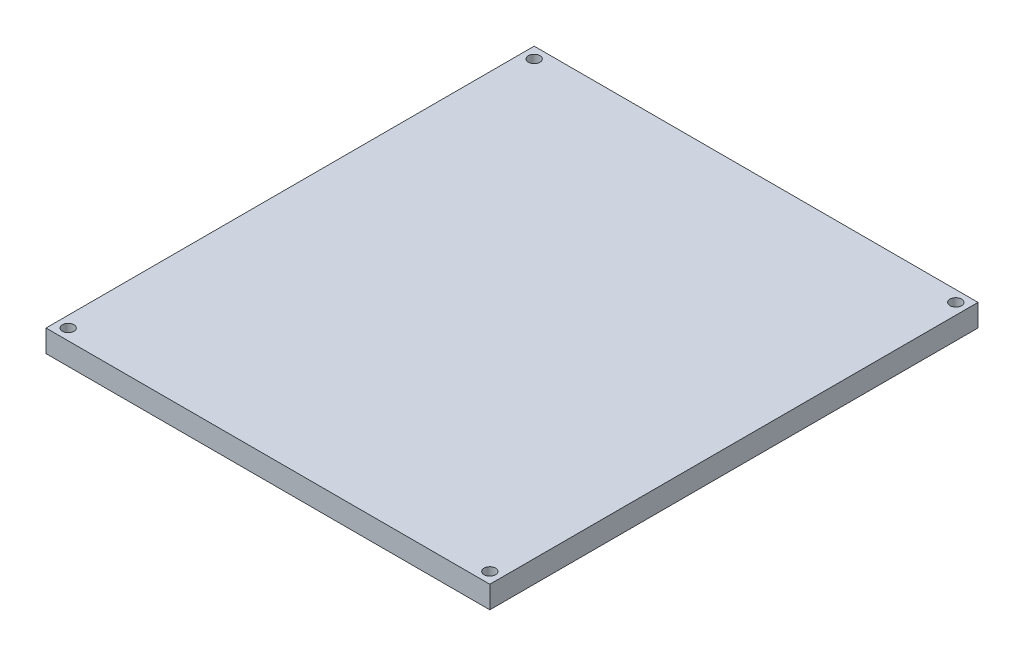
ISO-10303-21;
HEADER;
FILE_DESCRIPTION(('STEP AP214'),'2;1');
FILE_NAME('part.step','',(''),(''),'','','');
FILE_SCHEMA(('AUTOMOTIVE_DESIGN { 1 0 10303 214 1 1 1 1 }'));
ENDSEC;
DATA;
#1=APPLICATION_CONTEXT('core data for automotive mechanical design processes');
#2=APPLICATION_PROTOCOL_DEFINITION('international standard','automotive_design',2000,#1);
#3=PRODUCT_CONTEXT('',#1,'mechanical');
#4=PRODUCT('Part','Part','',(#3));
#5=PRODUCT_RELATED_PRODUCT_CATEGORY('part','',(#4));
#6=PRODUCT_DEFINITION_FORMATION('','',#4);
#7=PRODUCT_DEFINITION_CONTEXT('part definition',#1,'design');
#8=PRODUCT_DEFINITION('design','',#6,#7);
#9=PRODUCT_DEFINITION_SHAPE('','',#8);
#10=(LENGTH_UNIT() NAMED_UNIT(*) SI_UNIT(.MILLI.,.METRE.));
#11=(NAMED_UNIT(*) PLANE_ANGLE_UNIT() SI_UNIT($,.RADIAN.));
#12=(NAMED_UNIT(*) SI_UNIT($,.STERADIAN.) SOLID_ANGLE_UNIT());
#13=UNCERTAINTY_MEASURE_WITH_UNIT(LENGTH_MEASURE(1.E-05),#10,'distance_accuracy_value','');
#14=(GEOMETRIC_REPRESENTATION_CONTEXT(3) GLOBAL_UNCERTAINTY_ASSIGNED_CONTEXT((#13)) GLOBAL_UNIT_ASSIGNED_CONTEXT((#10,
#11,#12)) REPRESENTATION_CONTEXT('',''));
#15=CARTESIAN_POINT('',(0.,0.,0.));
#16=DIRECTION('',(0.,0.,1.));
#17=DIRECTION('',(1.,0.,0.));
#18=AXIS2_PLACEMENT_3D('',#15,#16,#17);
#19=CARTESIAN_POINT('',(63.5,6.35,69.85));
#20=DIRECTION('',(-1.,0.,0.));
#21=DIRECTION('',(0.,0.,1.));
#22=AXIS2_PLACEMENT_3D('',#19,#20,#21);
#23=PLANE('',#22);
#24=DIRECTION('',(0.,0.,-1.));
#25=VECTOR('',#24,1.);
#26=CARTESIAN_POINT('',(63.5,0.,69.85));
#27=LINE('',#26,#25);
#28=CARTESIAN_POINT('',(63.5,0.,69.85));
#29=VERTEX_POINT('',#28);
#30=CARTESIAN_POINT('',(63.5,0.,-69.85));
#31=VERTEX_POINT('',#30);
#32=EDGE_CURVE('E112',#29,#31,#27,.T.);
#33=ORIENTED_EDGE('',*,*,#32,.T.);
#34=DIRECTION('',(0.,-1.,0.));
#35=VECTOR('',#34,1.);
#36=CARTESIAN_POINT('',(63.5,6.35,-69.85));
#37=LINE('',#36,#35);
#38=CARTESIAN_POINT('',(63.5,6.35,-69.85));
#39=VERTEX_POINT('',#38);
#40=EDGE_CURVE('E11',#39,#31,#37,.T.);
#41=ORIENTED_EDGE('',*,*,#40,.F.);
#42=DIRECTION('',(0.,0.,-1.));
#43=VECTOR('',#42,1.);
#44=CARTESIAN_POINT('',(63.5,6.35,69.85));
#45=LINE('',#44,#43);
#46=CARTESIAN_POINT('',(63.5,6.35,69.85));
#47=VERTEX_POINT('',#46);
#48=EDGE_CURVE('E96',#47,#39,#45,.T.);
#49=ORIENTED_EDGE('',*,*,#48,.F.);
#50=DIRECTION('',(0.,-1.,0.));
#51=VECTOR('',#50,1.);
#52=CARTESIAN_POINT('',(63.5,6.35,69.85));
#53=LINE('',#52,#51);
#54=EDGE_CURVE('E108',#47,#29,#53,.T.);
#55=ORIENTED_EDGE('',*,*,#54,.T.);
#56=EDGE_LOOP('',(#33,#41,#49,#55));
#57=FACE_BOUND('',#56,.T.);
#58=ADVANCED_FACE('F44',(#57),#23,.F.);
#59=CARTESIAN_POINT('',(-63.5,6.35,-69.85));
#60=DIRECTION('',(0.,0.,1.));
#61=DIRECTION('',(1.,0.,0.));
#62=AXIS2_PLACEMENT_3D('',#59,#60,#61);
#63=PLANE('',#62);
#64=DIRECTION('',(-1.,0.,0.));
#65=VECTOR('',#64,1.);
#66=CARTESIAN_POINT('',(-63.5,0.,-69.85));
#67=LINE('',#66,#65);
#68=CARTESIAN_POINT('',(-63.5,0.,-69.85));
#69=VERTEX_POINT('',#68);
#70=EDGE_CURVE('E101',#31,#69,#67,.T.);
#71=ORIENTED_EDGE('',*,*,#70,.T.);
#72=DIRECTION('',(0.,-1.,0.));
#73=VECTOR('',#72,1.);
#74=CARTESIAN_POINT('',(-63.5,6.35,-69.85));
#75=LINE('',#74,#73);
#76=CARTESIAN_POINT('',(-63.5,6.35,-69.85));
#77=VERTEX_POINT('',#76);
#78=EDGE_CURVE('E53',#77,#69,#75,.T.);
#79=ORIENTED_EDGE('',*,*,#78,.F.);
#80=DIRECTION('',(-1.,0.,0.));
#81=VECTOR('',#80,1.);
#82=CARTESIAN_POINT('',(-63.5,6.35,-69.85));
#83=LINE('',#82,#81);
#84=EDGE_CURVE('E91',#39,#77,#83,.T.);
#85=ORIENTED_EDGE('',*,*,#84,.F.);
#86=ORIENTED_EDGE('',*,*,#40,.T.);
#87=EDGE_LOOP('',(#71,#79,#85,#86));
#88=FACE_BOUND('',#87,.T.);
#89=ADVANCED_FACE('F100',(#88),#63,.F.);
#90=CARTESIAN_POINT('',(-63.5,6.35,69.85));
#91=DIRECTION('',(1.,0.,0.));
#92=DIRECTION('',(0.,0.,-1.));
#93=AXIS2_PLACEMENT_3D('',#90,#91,#92);
#94=PLANE('',#93);
#95=DIRECTION('',(0.,0.,1.));
#96=VECTOR('',#95,1.);
#97=CARTESIAN_POINT('',(-63.5,0.,69.85));
#98=LINE('',#97,#96);
#99=CARTESIAN_POINT('',(-63.5,0.,69.85));
#100=VERTEX_POINT('',#99);
#101=EDGE_CURVE('E78',#69,#100,#98,.T.);
#102=ORIENTED_EDGE('',*,*,#101,.T.);
#103=DIRECTION('',(0.,-1.,0.));
#104=VECTOR('',#103,1.);
#105=CARTESIAN_POINT('',(-63.5,6.35,69.85));
#106=LINE('',#105,#104);
#107=CARTESIAN_POINT('',(-63.5,6.35,69.85));
#108=VERTEX_POINT('',#107);
#109=EDGE_CURVE('E103',#108,#100,#106,.T.);
#110=ORIENTED_EDGE('',*,*,#109,.F.);
#111=DIRECTION('',(0.,0.,1.));
#112=VECTOR('',#111,1.);
#113=CARTESIAN_POINT('',(-63.5,6.35,69.85));
#114=LINE('',#113,#112);
#115=EDGE_CURVE('E94',#77,#108,#114,.T.);
#116=ORIENTED_EDGE('',*,*,#115,.F.);
#117=ORIENTED_EDGE('',*,*,#78,.T.);
#118=EDGE_LOOP('',(#102,#110,#116,#117));
#119=FACE_BOUND('',#118,.T.);
#120=ADVANCED_FACE('F104',(#119),#94,.F.);
#121=CARTESIAN_POINT('',(-63.5,6.35,69.85));
#122=DIRECTION('',(0.,0.,-1.));
#123=DIRECTION('',(-1.,0.,0.));
#124=AXIS2_PLACEMENT_3D('',#121,#122,#123);
#125=PLANE('',#124);
#126=DIRECTION('',(1.,0.,0.));
#127=VECTOR('',#126,1.);
#128=CARTESIAN_POINT('',(-63.5,0.,69.85));
#129=LINE('',#128,#127);
#130=EDGE_CURVE('E84',#100,#29,#129,.T.);
#131=ORIENTED_EDGE('',*,*,#130,.T.);
#132=ORIENTED_EDGE('',*,*,#54,.F.);
#133=DIRECTION('',(1.,0.,0.));
#134=VECTOR('',#133,1.);
#135=CARTESIAN_POINT('',(-63.5,6.35,69.85));
#136=LINE('',#135,#134);
#137=EDGE_CURVE('E61',#108,#47,#136,.T.);
#138=ORIENTED_EDGE('',*,*,#137,.F.);
#139=ORIENTED_EDGE('',*,*,#109,.T.);
#140=EDGE_LOOP('',(#131,#132,#138,#139));
#141=FACE_BOUND('',#140,.T.);
#142=ADVANCED_FACE('F126',(#141),#125,.F.);
#143=CARTESIAN_POINT('',(0.,6.35,0.));
#144=DIRECTION('',(0.,-1.,0.));
#145=DIRECTION('',(0.,0.,-1.));
#146=AXIS2_PLACEMENT_3D('',#143,#144,#145);
#147=PLANE('',#146);
#148=CARTESIAN_POINT('',(-60.325,6.35,-66.675));
#149=DIRECTION('',(0.,1.,0.));
#150=DIRECTION('',(0.,0.,1.));
#151=AXIS2_PLACEMENT_3D('',#148,#149,#150);
#152=CIRCLE('',#151,1.65);
#153=CARTESIAN_POINT('',(-60.325,6.35,-65.025));
#154=VERTEX_POINT('',#153);
#155=EDGE_CURVE('E145',#154,#154,#152,.T.);
#156=ORIENTED_EDGE('',*,*,#155,.F.);
#157=EDGE_LOOP('',(#156));
#158=FACE_BOUND('',#157,.T.);
#159=CARTESIAN_POINT('',(-60.325,6.35,66.675));
#160=DIRECTION('',(0.,1.,0.));
#161=DIRECTION('',(0.,0.,1.));
#162=AXIS2_PLACEMENT_3D('',#159,#160,#161);
#163=CIRCLE('',#162,1.65);
#164=CARTESIAN_POINT('',(-60.325,6.35,68.325));
#165=VERTEX_POINT('',#164);
#166=EDGE_CURVE('E153',#165,#165,#163,.T.);
#167=ORIENTED_EDGE('',*,*,#166,.F.);
#168=EDGE_LOOP('',(#167));
#169=FACE_BOUND('',#168,.T.);
#170=CARTESIAN_POINT('',(60.325,6.35,66.675));
#171=DIRECTION('',(0.,1.,0.));
#172=DIRECTION('',(0.,0.,1.));
#173=AXIS2_PLACEMENT_3D('',#170,#171,#172);
#174=CIRCLE('',#173,1.65);
#175=CARTESIAN_POINT('',(60.325,6.35,68.325));
#176=VERTEX_POINT('',#175);
#177=EDGE_CURVE('E137',#176,#176,#174,.T.);
#178=ORIENTED_EDGE('',*,*,#177,.F.);
#179=EDGE_LOOP('',(#178));
#180=FACE_BOUND('',#179,.T.);
#181=CARTESIAN_POINT('',(60.325,6.35,-66.675));
#182=DIRECTION('',(0.,1.,0.));
#183=DIRECTION('',(0.,0.,1.));
#184=AXIS2_PLACEMENT_3D('',#181,#182,#183);
#185=CIRCLE('',#184,1.65);
#186=CARTESIAN_POINT('',(60.325,6.35,-65.025));
#187=VERTEX_POINT('',#186);
#188=EDGE_CURVE('E133',#187,#187,#185,.T.);
#189=ORIENTED_EDGE('',*,*,#188,.F.);
#190=EDGE_LOOP('',(#189));
#191=FACE_BOUND('',#190,.T.);
#192=ORIENTED_EDGE('',*,*,#48,.T.);
#193=ORIENTED_EDGE('',*,*,#84,.T.);
#194=ORIENTED_EDGE('',*,*,#115,.T.);
#195=ORIENTED_EDGE('',*,*,#137,.T.);
#196=EDGE_LOOP('',(#192,#193,#194,#195));
#197=FACE_BOUND('',#196,.T.);
#198=ADVANCED_FACE('F92',(#158,#169,#180,#191,#197),#147,.F.);
#199=CARTESIAN_POINT('',(0.,0.,0.));
#200=DIRECTION('',(0.,-1.,0.));
#201=DIRECTION('',(0.,0.,-1.));
#202=AXIS2_PLACEMENT_3D('',#199,#200,#201);
#203=PLANE('',#202);
#204=CARTESIAN_POINT('',(-60.325,0.,-66.675));
#205=DIRECTION('',(0.,1.,0.));
#206=DIRECTION('',(0.,0.,1.));
#207=AXIS2_PLACEMENT_3D('',#204,#205,#206);
#208=CIRCLE('',#207,1.65);
#209=CARTESIAN_POINT('',(-60.325,0.,-65.025));
#210=VERTEX_POINT('',#209);
#211=EDGE_CURVE('E141',#210,#210,#208,.T.);
#212=ORIENTED_EDGE('',*,*,#211,.T.);
#213=EDGE_LOOP('',(#212));
#214=FACE_BOUND('',#213,.T.);
#215=CARTESIAN_POINT('',(-60.325,0.,66.675));
#216=DIRECTION('',(0.,1.,0.));
#217=DIRECTION('',(0.,0.,1.));
#218=AXIS2_PLACEMENT_3D('',#215,#216,#217);
#219=CIRCLE('',#218,1.65);
#220=CARTESIAN_POINT('',(-60.325,0.,68.325));
#221=VERTEX_POINT('',#220);
#222=EDGE_CURVE('E149',#221,#221,#219,.T.);
#223=ORIENTED_EDGE('',*,*,#222,.T.);
#224=EDGE_LOOP('',(#223));
#225=FACE_BOUND('',#224,.T.);
#226=CARTESIAN_POINT('',(60.325,0.,66.675));
#227=DIRECTION('',(0.,1.,0.));
#228=DIRECTION('',(0.,0.,1.));
#229=AXIS2_PLACEMENT_3D('',#226,#227,#228);
#230=CIRCLE('',#229,1.65);
#231=CARTESIAN_POINT('',(60.325,0.,68.325));
#232=VERTEX_POINT('',#231);
#233=EDGE_CURVE('E157',#232,#232,#230,.T.);
#234=ORIENTED_EDGE('',*,*,#233,.T.);
#235=EDGE_LOOP('',(#234));
#236=FACE_BOUND('',#235,.T.);
#237=CARTESIAN_POINT('',(60.325,0.,-66.675));
#238=DIRECTION('',(0.,1.,0.));
#239=DIRECTION('',(0.,0.,1.));
#240=AXIS2_PLACEMENT_3D('',#237,#238,#239);
#241=CIRCLE('',#240,1.65);
#242=CARTESIAN_POINT('',(60.325,0.,-65.025));
#243=VERTEX_POINT('',#242);
#244=EDGE_CURVE('E116',#243,#243,#241,.T.);
#245=ORIENTED_EDGE('',*,*,#244,.T.);
#246=EDGE_LOOP('',(#245));
#247=FACE_BOUND('',#246,.T.);
#248=ORIENTED_EDGE('',*,*,#32,.F.);
#249=ORIENTED_EDGE('',*,*,#130,.F.);
#250=ORIENTED_EDGE('',*,*,#101,.F.);
#251=ORIENTED_EDGE('',*,*,#70,.F.);
#252=EDGE_LOOP('',(#248,#249,#250,#251));
#253=FACE_BOUND('',#252,.T.);
#254=ADVANCED_FACE('F129',(#214,#225,#236,#247,#253),#203,.T.);
#255=CARTESIAN_POINT('',(60.325,0.,-66.675));
#256=DIRECTION('',(0.,1.,0.));
#257=DIRECTION('',(0.,0.,1.));
#258=AXIS2_PLACEMENT_3D('',#255,#256,#257);
#259=CYLINDRICAL_SURFACE('',#258,1.65);
#260=ORIENTED_EDGE('',*,*,#244,.F.);
#261=EDGE_LOOP('',(#260));
#262=FACE_BOUND('',#261,.T.);
#263=ORIENTED_EDGE('',*,*,#188,.T.);
#264=EDGE_LOOP('',(#263));
#265=FACE_BOUND('',#264,.T.);
#266=ADVANCED_FACE('F173',(#262,#265),#259,.F.);
#267=CARTESIAN_POINT('',(60.325,0.,66.675));
#268=DIRECTION('',(0.,1.,0.));
#269=DIRECTION('',(0.,0.,1.));
#270=AXIS2_PLACEMENT_3D('',#267,#268,#269);
#271=CYLINDRICAL_SURFACE('',#270,1.65);
#272=ORIENTED_EDGE('',*,*,#233,.F.);
#273=EDGE_LOOP('',(#272));
#274=FACE_BOUND('',#273,.T.);
#275=ORIENTED_EDGE('',*,*,#177,.T.);
#276=EDGE_LOOP('',(#275));
#277=FACE_BOUND('',#276,.T.);
#278=ADVANCED_FACE('F165',(#274,#277),#271,.F.);
#279=CARTESIAN_POINT('',(-60.325,0.,66.675));
#280=DIRECTION('',(0.,1.,0.));
#281=DIRECTION('',(0.,0.,1.));
#282=AXIS2_PLACEMENT_3D('',#279,#280,#281);
#283=CYLINDRICAL_SURFACE('',#282,1.65);
#284=ORIENTED_EDGE('',*,*,#222,.F.);
#285=EDGE_LOOP('',(#284));
#286=FACE_BOUND('',#285,.T.);
#287=ORIENTED_EDGE('',*,*,#166,.T.);
#288=EDGE_LOOP('',(#287));
#289=FACE_BOUND('',#288,.T.);
#290=ADVANCED_FACE('F181',(#286,#289),#283,.F.);
#291=CARTESIAN_POINT('',(-60.325,0.,-66.675));
#292=DIRECTION('',(0.,1.,0.));
#293=DIRECTION('',(0.,0.,1.));
#294=AXIS2_PLACEMENT_3D('',#291,#292,#293);
#295=CYLINDRICAL_SURFACE('',#294,1.65);
#296=ORIENTED_EDGE('',*,*,#211,.F.);
#297=EDGE_LOOP('',(#296));
#298=FACE_BOUND('',#297,.T.);
#299=ORIENTED_EDGE('',*,*,#155,.T.);
#300=EDGE_LOOP('',(#299));
#301=FACE_BOUND('',#300,.T.);
#302=ADVANCED_FACE('F232',(#298,#301),#295,.F.);
#303=CLOSED_SHELL('',(#58,#89,#120,#142,#198,#254,#266,#278,#290,#302));
#304=MANIFOLD_SOLID_BREP('B2',#303);
#305=ADVANCED_BREP_SHAPE_REPRESENTATION('',(#18,#304),#14);
#306=SHAPE_DEFINITION_REPRESENTATION(#9,#305);
ENDSEC;
END-ISO-10303-21;
